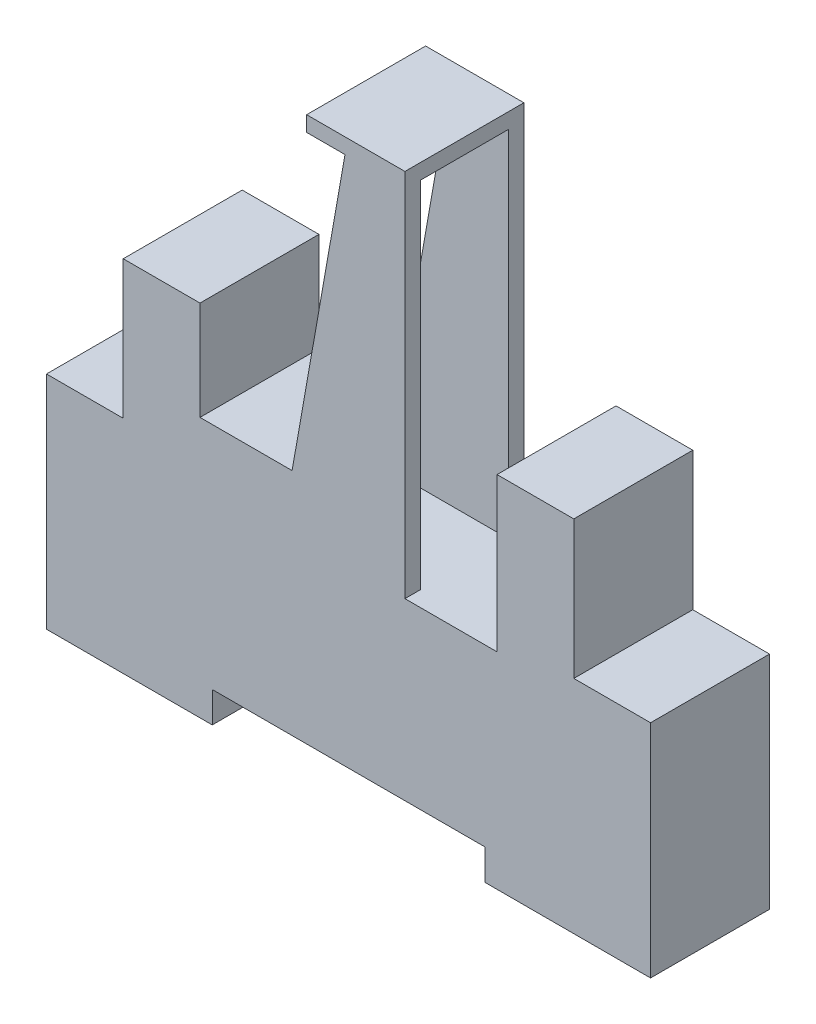
ISO-10303-21;
HEADER;
FILE_DESCRIPTION(('STEP AP214'),'2;1');
FILE_NAME('part.step','',(''),(''),'','','');
FILE_SCHEMA(('AUTOMOTIVE_DESIGN { 1 0 10303 214 1 1 1 1 }'));
ENDSEC;
DATA;
#1=APPLICATION_CONTEXT('core data for automotive mechanical design processes');
#2=APPLICATION_PROTOCOL_DEFINITION('international standard','automotive_design',2000,#1);
#3=PRODUCT_CONTEXT('',#1,'mechanical');
#4=PRODUCT('Part','Part','',(#3));
#5=PRODUCT_RELATED_PRODUCT_CATEGORY('part','',(#4));
#6=PRODUCT_DEFINITION_FORMATION('','',#4);
#7=PRODUCT_DEFINITION_CONTEXT('part definition',#1,'design');
#8=PRODUCT_DEFINITION('design','',#6,#7);
#9=PRODUCT_DEFINITION_SHAPE('','',#8);
#10=(LENGTH_UNIT() NAMED_UNIT(*) SI_UNIT(.MILLI.,.METRE.));
#11=(NAMED_UNIT(*) PLANE_ANGLE_UNIT() SI_UNIT($,.RADIAN.));
#12=(NAMED_UNIT(*) SI_UNIT($,.STERADIAN.) SOLID_ANGLE_UNIT());
#13=UNCERTAINTY_MEASURE_WITH_UNIT(LENGTH_MEASURE(1.E-05),#10,'distance_accuracy_value','');
#14=(GEOMETRIC_REPRESENTATION_CONTEXT(3) GLOBAL_UNCERTAINTY_ASSIGNED_CONTEXT((#13)) GLOBAL_UNIT_ASSIGNED_CONTEXT((#10,
#11,#12)) REPRESENTATION_CONTEXT('',''));
#15=CARTESIAN_POINT('',(0.,0.,0.));
#16=DIRECTION('',(0.,0.,1.));
#17=DIRECTION('',(1.,0.,0.));
#18=AXIS2_PLACEMENT_3D('',#15,#16,#17);
#19=CARTESIAN_POINT('',(-7.35,33.9,15.5));
#20=DIRECTION('',(0.984807753012209,-0.173648177666926,0.));
#21=DIRECTION('',(0.173648177666926,0.984807753012209,0.));
#22=AXIS2_PLACEMENT_3D('',#19,#20,#21);
#23=PLANE('',#22);
#24=DIRECTION('',(0.173648177666926,0.984807753012209,0.));
#25=VECTOR('',#24,1.);
#26=CARTESIAN_POINT('',(-7.35,33.9,13.5));
#27=LINE('',#26,#25);
#28=CARTESIAN_POINT('',(-7.35,33.9,13.5));
#29=VERTEX_POINT('',#28);
#30=CARTESIAN_POINT('',(-0.455615054299177,73.,13.5));
#31=VERTEX_POINT('',#30);
#32=EDGE_CURVE('E45',#29,#31,#27,.T.);
#33=ORIENTED_EDGE('',*,*,#32,.F.);
#34=DIRECTION('',(0.,0.,-1.));
#35=VECTOR('',#34,1.);
#36=CARTESIAN_POINT('',(-7.35,33.9,15.5));
#37=LINE('',#36,#35);
#38=CARTESIAN_POINT('',(-7.35,33.9,15.5));
#39=VERTEX_POINT('',#38);
#40=EDGE_CURVE('E368',#39,#29,#37,.T.);
#41=ORIENTED_EDGE('',*,*,#40,.F.);
#42=DIRECTION('',(-0.173648177666927,-0.984807753012209,0.));
#43=VECTOR('',#42,1.);
#44=CARTESIAN_POINT('',(-7.35,33.9,15.5));
#45=LINE('',#44,#43);
#46=CARTESIAN_POINT('',(-0.455615054299175,73.,15.5));
#47=VERTEX_POINT('',#46);
#48=EDGE_CURVE('E288',#47,#39,#45,.T.);
#49=ORIENTED_EDGE('',*,*,#48,.F.);
#50=DIRECTION('',(0.,0.,-1.));
#51=VECTOR('',#50,1.);
#52=CARTESIAN_POINT('',(-0.455615054299175,73.,15.5));
#53=LINE('',#52,#51);
#54=EDGE_CURVE('E372',#47,#31,#53,.T.);
#55=ORIENTED_EDGE('',*,*,#54,.T.);
#56=EDGE_LOOP('',(#33,#41,#49,#55));
#57=FACE_BOUND('',#56,.T.);
#58=ADVANCED_FACE('F37',(#57),#23,.F.);
#59=CARTESIAN_POINT('',(-17.75,0.,15.5));
#60=DIRECTION('',(0.,1.,0.));
#61=DIRECTION('',(-1.,0.,0.));
#62=AXIS2_PLACEMENT_3D('',#59,#60,#61);
#63=PLANE('',#62);
#64=DIRECTION('',(1.,0.,0.));
#65=VECTOR('',#64,1.);
#66=CARTESIAN_POINT('',(-17.75,0.,0.));
#67=LINE('',#66,#65);
#68=CARTESIAN_POINT('',(-39.35,0.,0.));
#69=VERTEX_POINT('',#68);
#70=CARTESIAN_POINT('',(-17.75,0.,0.));
#71=VERTEX_POINT('',#70);
#72=EDGE_CURVE('E255',#69,#71,#67,.T.);
#73=ORIENTED_EDGE('',*,*,#72,.T.);
#74=DIRECTION('',(0.,0.,-1.));
#75=VECTOR('',#74,1.);
#76=CARTESIAN_POINT('',(-17.75,0.,15.5));
#77=LINE('',#76,#75);
#78=CARTESIAN_POINT('',(-17.75,0.,15.5));
#79=VERTEX_POINT('',#78);
#80=EDGE_CURVE('E413',#79,#71,#77,.T.);
#81=ORIENTED_EDGE('',*,*,#80,.F.);
#82=DIRECTION('',(1.,0.,0.));
#83=VECTOR('',#82,1.);
#84=CARTESIAN_POINT('',(-17.75,0.,15.5));
#85=LINE('',#84,#83);
#86=CARTESIAN_POINT('',(-39.35,0.,15.5));
#87=VERTEX_POINT('',#86);
#88=EDGE_CURVE('E256',#87,#79,#85,.T.);
#89=ORIENTED_EDGE('',*,*,#88,.F.);
#90=DIRECTION('',(0.,0.,-1.));
#91=VECTOR('',#90,1.);
#92=CARTESIAN_POINT('',(-39.35,0.,15.5));
#93=LINE('',#92,#91);
#94=EDGE_CURVE('E302',#87,#69,#93,.T.);
#95=ORIENTED_EDGE('',*,*,#94,.T.);
#96=EDGE_LOOP('',(#73,#81,#89,#95));
#97=FACE_BOUND('',#96,.T.);
#98=ADVANCED_FACE('F39',(#97),#63,.F.);
#99=CARTESIAN_POINT('',(-17.75,3.99999999999999,15.5));
#100=DIRECTION('',(-1.,0.,0.));
#101=DIRECTION('',(0.,0.,1.));
#102=AXIS2_PLACEMENT_3D('',#99,#100,#101);
#103=PLANE('',#102);
#104=DIRECTION('',(0.,1.,0.));
#105=VECTOR('',#104,1.);
#106=CARTESIAN_POINT('',(-17.75,3.99999999999999,0.));
#107=LINE('',#106,#105);
#108=CARTESIAN_POINT('',(-17.75,3.99999999999999,0.));
#109=VERTEX_POINT('',#108);
#110=EDGE_CURVE('E305',#71,#109,#107,.T.);
#111=ORIENTED_EDGE('',*,*,#110,.T.);
#112=DIRECTION('',(0.,0.,-1.));
#113=VECTOR('',#112,1.);
#114=CARTESIAN_POINT('',(-17.75,3.99999999999999,15.5));
#115=LINE('',#114,#113);
#116=CARTESIAN_POINT('',(-17.75,3.99999999999999,15.5));
#117=VERTEX_POINT('',#116);
#118=EDGE_CURVE('E410',#117,#109,#115,.T.);
#119=ORIENTED_EDGE('',*,*,#118,.F.);
#120=DIRECTION('',(0.,1.,0.));
#121=VECTOR('',#120,1.);
#122=CARTESIAN_POINT('',(-17.75,3.99999999999999,15.5));
#123=LINE('',#122,#121);
#124=EDGE_CURVE('E259',#79,#117,#123,.T.);
#125=ORIENTED_EDGE('',*,*,#124,.F.);
#126=ORIENTED_EDGE('',*,*,#80,.T.);
#127=EDGE_LOOP('',(#111,#119,#125,#126));
#128=FACE_BOUND('',#127,.T.);
#129=ADVANCED_FACE('F476',(#128),#103,.F.);
#130=CARTESIAN_POINT('',(17.75,4.,15.5));
#131=DIRECTION('',(0.,1.,0.));
#132=DIRECTION('',(-1.,0.,0.));
#133=AXIS2_PLACEMENT_3D('',#130,#131,#132);
#134=PLANE('',#133);
#135=CARTESIAN_POINT('',(-1.65,4.,7.75));
#136=DIRECTION('',(0.,1.,0.));
#137=DIRECTION('',(-1.,0.,0.));
#138=AXIS2_PLACEMENT_3D('',#135,#136,#137);
#139=CIRCLE('',#138,1.6);
#140=CARTESIAN_POINT('',(-3.25,4.,7.75));
#141=VERTEX_POINT('',#140);
#142=EDGE_CURVE('E224',#141,#141,#139,.F.);
#143=ORIENTED_EDGE('',*,*,#142,.F.);
#144=EDGE_LOOP('',(#143));
#145=FACE_BOUND('',#144,.T.);
#146=DIRECTION('',(1.,0.,0.));
#147=VECTOR('',#146,1.);
#148=CARTESIAN_POINT('',(17.75,4.,0.));
#149=LINE('',#148,#147);
#150=CARTESIAN_POINT('',(17.75,4.,0.));
#151=VERTEX_POINT('',#150);
#152=EDGE_CURVE('E307',#109,#151,#149,.T.);
#153=ORIENTED_EDGE('',*,*,#152,.T.);
#154=DIRECTION('',(0.,0.,-1.));
#155=VECTOR('',#154,1.);
#156=CARTESIAN_POINT('',(17.75,4.,15.5));
#157=LINE('',#156,#155);
#158=CARTESIAN_POINT('',(17.75,4.,15.5));
#159=VERTEX_POINT('',#158);
#160=EDGE_CURVE('E407',#159,#151,#157,.T.);
#161=ORIENTED_EDGE('',*,*,#160,.F.);
#162=DIRECTION('',(1.,0.,0.));
#163=VECTOR('',#162,1.);
#164=CARTESIAN_POINT('',(17.75,4.,15.5));
#165=LINE('',#164,#163);
#166=EDGE_CURVE('E262',#117,#159,#165,.T.);
#167=ORIENTED_EDGE('',*,*,#166,.F.);
#168=ORIENTED_EDGE('',*,*,#118,.T.);
#169=EDGE_LOOP('',(#153,#161,#167,#168));
#170=FACE_BOUND('',#169,.T.);
#171=ADVANCED_FACE('F647',(#145,#170),#134,.F.);
#172=CARTESIAN_POINT('',(17.75,0.,15.5));
#173=DIRECTION('',(1.,0.,0.));
#174=DIRECTION('',(0.,0.,-1.));
#175=AXIS2_PLACEMENT_3D('',#172,#173,#174);
#176=PLANE('',#175);
#177=DIRECTION('',(0.,-1.,0.));
#178=VECTOR('',#177,1.);
#179=CARTESIAN_POINT('',(17.75,0.,0.));
#180=LINE('',#179,#178);
#181=CARTESIAN_POINT('',(17.75,0.,0.));
#182=VERTEX_POINT('',#181);
#183=EDGE_CURVE('E309',#151,#182,#180,.T.);
#184=ORIENTED_EDGE('',*,*,#183,.T.);
#185=DIRECTION('',(0.,0.,-1.));
#186=VECTOR('',#185,1.);
#187=CARTESIAN_POINT('',(17.75,0.,15.5));
#188=LINE('',#187,#186);
#189=CARTESIAN_POINT('',(17.75,0.,15.5));
#190=VERTEX_POINT('',#189);
#191=EDGE_CURVE('E404',#190,#182,#188,.T.);
#192=ORIENTED_EDGE('',*,*,#191,.F.);
#193=DIRECTION('',(0.,-1.,0.));
#194=VECTOR('',#193,1.);
#195=CARTESIAN_POINT('',(17.75,0.,15.5));
#196=LINE('',#195,#194);
#197=EDGE_CURVE('E264',#159,#190,#196,.T.);
#198=ORIENTED_EDGE('',*,*,#197,.F.);
#199=ORIENTED_EDGE('',*,*,#160,.T.);
#200=EDGE_LOOP('',(#184,#192,#198,#199));
#201=FACE_BOUND('',#200,.T.);
#202=ADVANCED_FACE('F637',(#201),#176,.F.);
#203=CARTESIAN_POINT('',(39.35,0.,15.5));
#204=DIRECTION('',(0.,1.,0.));
#205=DIRECTION('',(-1.,0.,0.));
#206=AXIS2_PLACEMENT_3D('',#203,#204,#205);
#207=PLANE('',#206);
#208=DIRECTION('',(1.,0.,0.));
#209=VECTOR('',#208,1.);
#210=CARTESIAN_POINT('',(39.35,0.,0.));
#211=LINE('',#210,#209);
#212=CARTESIAN_POINT('',(39.35,0.,0.));
#213=VERTEX_POINT('',#212);
#214=EDGE_CURVE('E311',#182,#213,#211,.T.);
#215=ORIENTED_EDGE('',*,*,#214,.T.);
#216=DIRECTION('',(0.,0.,-1.));
#217=VECTOR('',#216,1.);
#218=CARTESIAN_POINT('',(39.35,0.,15.5));
#219=LINE('',#218,#217);
#220=CARTESIAN_POINT('',(39.35,0.,15.5));
#221=VERTEX_POINT('',#220);
#222=EDGE_CURVE('E401',#221,#213,#219,.T.);
#223=ORIENTED_EDGE('',*,*,#222,.F.);
#224=DIRECTION('',(1.,0.,0.));
#225=VECTOR('',#224,1.);
#226=CARTESIAN_POINT('',(39.35,0.,15.5));
#227=LINE('',#226,#225);
#228=EDGE_CURVE('E266',#190,#221,#227,.T.);
#229=ORIENTED_EDGE('',*,*,#228,.F.);
#230=ORIENTED_EDGE('',*,*,#191,.T.);
#231=EDGE_LOOP('',(#215,#223,#229,#230));
#232=FACE_BOUND('',#231,.T.);
#233=ADVANCED_FACE('F627',(#232),#207,.F.);
#234=CARTESIAN_POINT('',(39.35,28.8,15.5));
#235=DIRECTION('',(-1.,0.,0.));
#236=DIRECTION('',(0.,0.,1.));
#237=AXIS2_PLACEMENT_3D('',#234,#235,#236);
#238=PLANE('',#237);
#239=DIRECTION('',(0.,1.,0.));
#240=VECTOR('',#239,1.);
#241=CARTESIAN_POINT('',(39.35,28.8,0.));
#242=LINE('',#241,#240);
#243=CARTESIAN_POINT('',(39.35,28.8,0.));
#244=VERTEX_POINT('',#243);
#245=EDGE_CURVE('E313',#213,#244,#242,.T.);
#246=ORIENTED_EDGE('',*,*,#245,.T.);
#247=DIRECTION('',(0.,0.,-1.));
#248=VECTOR('',#247,1.);
#249=CARTESIAN_POINT('',(39.35,28.8,15.5));
#250=LINE('',#249,#248);
#251=CARTESIAN_POINT('',(39.35,28.8,15.5));
#252=VERTEX_POINT('',#251);
#253=EDGE_CURVE('E398',#252,#244,#250,.T.);
#254=ORIENTED_EDGE('',*,*,#253,.F.);
#255=DIRECTION('',(0.,1.,0.));
#256=VECTOR('',#255,1.);
#257=CARTESIAN_POINT('',(39.35,28.8,15.5));
#258=LINE('',#257,#256);
#259=EDGE_CURVE('E268',#221,#252,#258,.T.);
#260=ORIENTED_EDGE('',*,*,#259,.F.);
#261=ORIENTED_EDGE('',*,*,#222,.T.);
#262=EDGE_LOOP('',(#246,#254,#260,#261));
#263=FACE_BOUND('',#262,.T.);
#264=ADVANCED_FACE('F617',(#263),#238,.F.);
#265=CARTESIAN_POINT('',(29.35,28.8,15.5));
#266=DIRECTION('',(0.,-1.,0.));
#267=DIRECTION('',(0.,0.,-1.));
#268=AXIS2_PLACEMENT_3D('',#265,#266,#267);
#269=PLANE('',#268);
#270=DIRECTION('',(-1.,0.,0.));
#271=VECTOR('',#270,1.);
#272=CARTESIAN_POINT('',(29.35,28.8,0.));
#273=LINE('',#272,#271);
#274=CARTESIAN_POINT('',(29.35,28.8,0.));
#275=VERTEX_POINT('',#274);
#276=EDGE_CURVE('E315',#244,#275,#273,.T.);
#277=ORIENTED_EDGE('',*,*,#276,.T.);
#278=DIRECTION('',(0.,0.,-1.));
#279=VECTOR('',#278,1.);
#280=CARTESIAN_POINT('',(29.35,28.8,15.5));
#281=LINE('',#280,#279);
#282=CARTESIAN_POINT('',(29.35,28.8,15.5));
#283=VERTEX_POINT('',#282);
#284=EDGE_CURVE('E395',#283,#275,#281,.T.);
#285=ORIENTED_EDGE('',*,*,#284,.F.);
#286=DIRECTION('',(-1.,0.,0.));
#287=VECTOR('',#286,1.);
#288=CARTESIAN_POINT('',(29.35,28.8,15.5));
#289=LINE('',#288,#287);
#290=EDGE_CURVE('E270',#252,#283,#289,.T.);
#291=ORIENTED_EDGE('',*,*,#290,.F.);
#292=ORIENTED_EDGE('',*,*,#253,.T.);
#293=EDGE_LOOP('',(#277,#285,#291,#292));
#294=FACE_BOUND('',#293,.T.);
#295=ADVANCED_FACE('F607',(#294),#269,.F.);
#296=CARTESIAN_POINT('',(29.35,46.8,15.5));
#297=DIRECTION('',(-1.,0.,0.));
#298=DIRECTION('',(0.,-1.,0.));
#299=AXIS2_PLACEMENT_3D('',#296,#297,#298);
#300=PLANE('',#299);
#301=DIRECTION('',(0.,1.,0.));
#302=VECTOR('',#301,1.);
#303=CARTESIAN_POINT('',(29.35,46.8,0.));
#304=LINE('',#303,#302);
#305=CARTESIAN_POINT('',(29.35,46.8,0.));
#306=VERTEX_POINT('',#305);
#307=EDGE_CURVE('E317',#275,#306,#304,.T.);
#308=ORIENTED_EDGE('',*,*,#307,.T.);
#309=DIRECTION('',(0.,0.,-1.));
#310=VECTOR('',#309,1.);
#311=CARTESIAN_POINT('',(29.35,46.8,15.5));
#312=LINE('',#311,#310);
#313=CARTESIAN_POINT('',(29.35,46.8,15.5));
#314=VERTEX_POINT('',#313);
#315=EDGE_CURVE('E392',#314,#306,#312,.T.);
#316=ORIENTED_EDGE('',*,*,#315,.F.);
#317=DIRECTION('',(0.,1.,0.));
#318=VECTOR('',#317,1.);
#319=CARTESIAN_POINT('',(29.35,46.8,15.5));
#320=LINE('',#319,#318);
#321=EDGE_CURVE('E272',#283,#314,#320,.T.);
#322=ORIENTED_EDGE('',*,*,#321,.F.);
#323=ORIENTED_EDGE('',*,*,#284,.T.);
#324=EDGE_LOOP('',(#308,#316,#322,#323));
#325=FACE_BOUND('',#324,.T.);
#326=ADVANCED_FACE('F597',(#325),#300,.F.);
#327=CARTESIAN_POINT('',(19.35,46.8,15.5));
#328=DIRECTION('',(0.,-1.,0.));
#329=DIRECTION('',(0.,0.,-1.));
#330=AXIS2_PLACEMENT_3D('',#327,#328,#329);
#331=PLANE('',#330);
#332=DIRECTION('',(-1.,0.,0.));
#333=VECTOR('',#332,1.);
#334=CARTESIAN_POINT('',(19.35,46.8,0.));
#335=LINE('',#334,#333);
#336=CARTESIAN_POINT('',(19.35,46.8,0.));
#337=VERTEX_POINT('',#336);
#338=EDGE_CURVE('E319',#306,#337,#335,.T.);
#339=ORIENTED_EDGE('',*,*,#338,.T.);
#340=DIRECTION('',(0.,0.,-1.));
#341=VECTOR('',#340,1.);
#342=CARTESIAN_POINT('',(19.35,46.8,15.5));
#343=LINE('',#342,#341);
#344=CARTESIAN_POINT('',(19.35,46.8,15.5));
#345=VERTEX_POINT('',#344);
#346=EDGE_CURVE('E389',#345,#337,#343,.T.);
#347=ORIENTED_EDGE('',*,*,#346,.F.);
#348=DIRECTION('',(-1.,0.,0.));
#349=VECTOR('',#348,1.);
#350=CARTESIAN_POINT('',(19.35,46.8,15.5));
#351=LINE('',#350,#349);
#352=EDGE_CURVE('E274',#314,#345,#351,.T.);
#353=ORIENTED_EDGE('',*,*,#352,.F.);
#354=ORIENTED_EDGE('',*,*,#315,.T.);
#355=EDGE_LOOP('',(#339,#347,#353,#354));
#356=FACE_BOUND('',#355,.T.);
#357=ADVANCED_FACE('F588',(#356),#331,.F.);
#358=CARTESIAN_POINT('',(19.35,26.8,15.5));
#359=DIRECTION('',(1.,0.,0.));
#360=DIRECTION('',(0.,0.,-1.));
#361=AXIS2_PLACEMENT_3D('',#358,#359,#360);
#362=PLANE('',#361);
#363=DIRECTION('',(0.,-1.,0.));
#364=VECTOR('',#363,1.);
#365=CARTESIAN_POINT('',(19.35,26.8,0.));
#366=LINE('',#365,#364);
#367=CARTESIAN_POINT('',(19.35,26.8,0.));
#368=VERTEX_POINT('',#367);
#369=EDGE_CURVE('E321',#337,#368,#366,.T.);
#370=ORIENTED_EDGE('',*,*,#369,.T.);
#371=DIRECTION('',(0.,0.,-1.));
#372=VECTOR('',#371,1.);
#373=CARTESIAN_POINT('',(19.35,26.8,15.5));
#374=LINE('',#373,#372);
#375=CARTESIAN_POINT('',(19.35,26.8,15.5));
#376=VERTEX_POINT('',#375);
#377=EDGE_CURVE('E386',#376,#368,#374,.T.);
#378=ORIENTED_EDGE('',*,*,#377,.F.);
#379=DIRECTION('',(0.,-1.,0.));
#380=VECTOR('',#379,1.);
#381=CARTESIAN_POINT('',(19.35,26.8,15.5));
#382=LINE('',#381,#380);
#383=EDGE_CURVE('E276',#345,#376,#382,.T.);
#384=ORIENTED_EDGE('',*,*,#383,.F.);
#385=ORIENTED_EDGE('',*,*,#346,.T.);
#386=EDGE_LOOP('',(#370,#378,#384,#385));
#387=FACE_BOUND('',#386,.T.);
#388=ADVANCED_FACE('F455',(#387),#362,.F.);
#389=CARTESIAN_POINT('',(7.34999999999999,26.8,15.5));
#390=DIRECTION('',(0.,-1.,0.));
#391=DIRECTION('',(0.,0.,-1.));
#392=AXIS2_PLACEMENT_3D('',#389,#390,#391);
#393=PLANE('',#392);
#394=CARTESIAN_POINT('',(-1.65,26.8,7.75));
#395=DIRECTION('',(0.,-1.,0.));
#396=DIRECTION('',(0.,0.,-1.));
#397=AXIS2_PLACEMENT_3D('',#394,#395,#396);
#398=CIRCLE('',#397,1.6);
#399=CARTESIAN_POINT('',(-1.65,26.8,6.15));
#400=VERTEX_POINT('',#399);
#401=EDGE_CURVE('E731',#400,#400,#398,.F.);
#402=ORIENTED_EDGE('',*,*,#401,.F.);
#403=EDGE_LOOP('',(#402));
#404=FACE_BOUND('',#403,.T.);
#405=DIRECTION('',(0.,0.,-1.));
#406=VECTOR('',#405,1.);
#407=CARTESIAN_POINT('',(7.34999999999999,26.8,15.5));
#408=LINE('',#407,#406);
#409=CARTESIAN_POINT('',(7.34999999999999,26.8,2.));
#410=VERTEX_POINT('',#409);
#411=CARTESIAN_POINT('',(7.34999999999999,26.8,0.));
#412=VERTEX_POINT('',#411);
#413=EDGE_CURVE('E383',#410,#412,#408,.T.);
#414=ORIENTED_EDGE('',*,*,#413,.F.);
#415=DIRECTION('',(1.,0.,0.));
#416=VECTOR('',#415,1.);
#417=CARTESIAN_POINT('',(-7.35,26.8,2.));
#418=LINE('',#417,#416);
#419=CARTESIAN_POINT('',(-7.35,26.8,2.));
#420=VERTEX_POINT('',#419);
#421=EDGE_CURVE('E233',#420,#410,#418,.T.);
#422=ORIENTED_EDGE('',*,*,#421,.F.);
#423=DIRECTION('',(0.,0.,1.));
#424=VECTOR('',#423,1.);
#425=CARTESIAN_POINT('',(-7.35,26.8,-49.4412663481516));
#426=LINE('',#425,#424);
#427=CARTESIAN_POINT('',(-7.35,26.8,13.5));
#428=VERTEX_POINT('',#427);
#429=EDGE_CURVE('E217',#420,#428,#426,.T.);
#430=ORIENTED_EDGE('',*,*,#429,.T.);
#431=DIRECTION('',(1.,0.,0.));
#432=VECTOR('',#431,1.);
#433=CARTESIAN_POINT('',(-7.35,26.8,13.5));
#434=LINE('',#433,#432);
#435=CARTESIAN_POINT('',(7.34999999999999,26.8,13.5));
#436=VERTEX_POINT('',#435);
#437=EDGE_CURVE('E223',#428,#436,#434,.T.);
#438=ORIENTED_EDGE('',*,*,#437,.T.);
#439=CARTESIAN_POINT('',(7.34999999999999,26.8,15.5));
#440=VERTEX_POINT('',#439);
#441=EDGE_CURVE('E384',#440,#436,#408,.T.);
#442=ORIENTED_EDGE('',*,*,#441,.F.);
#443=DIRECTION('',(-1.,0.,0.));
#444=VECTOR('',#443,1.);
#445=CARTESIAN_POINT('',(7.34999999999999,26.8,15.5));
#446=LINE('',#445,#444);
#447=EDGE_CURVE('E278',#376,#440,#446,.T.);
#448=ORIENTED_EDGE('',*,*,#447,.F.);
#449=ORIENTED_EDGE('',*,*,#377,.T.);
#450=DIRECTION('',(-1.,0.,0.));
#451=VECTOR('',#450,1.);
#452=CARTESIAN_POINT('',(7.34999999999999,26.8,0.));
#453=LINE('',#452,#451);
#454=EDGE_CURVE('E323',#368,#412,#453,.T.);
#455=ORIENTED_EDGE('',*,*,#454,.T.);
#456=EDGE_LOOP('',(#414,#422,#430,#438,#442,#448,#449,#455));
#457=FACE_BOUND('',#456,.T.);
#458=ADVANCED_FACE('F230',(#404,#457),#393,.F.);
#459=CARTESIAN_POINT('',(7.34999999999999,75.,15.5));
#460=DIRECTION('',(-1.,0.,0.));
#461=DIRECTION('',(0.,-1.,0.));
#462=AXIS2_PLACEMENT_3D('',#459,#460,#461);
#463=PLANE('',#462);
#464=DIRECTION('',(0.,0.,-1.));
#465=VECTOR('',#464,1.);
#466=CARTESIAN_POINT('',(7.34999999999999,73.,15.5));
#467=LINE('',#466,#465);
#468=CARTESIAN_POINT('',(7.34999999999999,73.,13.5));
#469=VERTEX_POINT('',#468);
#470=CARTESIAN_POINT('',(7.34999999999999,73.,2.));
#471=VERTEX_POINT('',#470);
#472=EDGE_CURVE('E234',#469,#471,#467,.T.);
#473=ORIENTED_EDGE('',*,*,#472,.T.);
#474=DIRECTION('',(0.,-1.,0.));
#475=VECTOR('',#474,1.);
#476=CARTESIAN_POINT('',(7.34999999999999,75.,2.));
#477=LINE('',#476,#475);
#478=EDGE_CURVE('E252',#471,#410,#477,.T.);
#479=ORIENTED_EDGE('',*,*,#478,.T.);
#480=ORIENTED_EDGE('',*,*,#413,.T.);
#481=DIRECTION('',(0.,1.,0.));
#482=VECTOR('',#481,1.);
#483=CARTESIAN_POINT('',(7.34999999999999,75.,0.));
#484=LINE('',#483,#482);
#485=CARTESIAN_POINT('',(7.34999999999999,75.,0.));
#486=VERTEX_POINT('',#485);
#487=EDGE_CURVE('E326',#412,#486,#484,.T.);
#488=ORIENTED_EDGE('',*,*,#487,.T.);
#489=DIRECTION('',(0.,0.,-1.));
#490=VECTOR('',#489,1.);
#491=CARTESIAN_POINT('',(7.34999999999999,75.,15.5));
#492=LINE('',#491,#490);
#493=CARTESIAN_POINT('',(7.34999999999999,75.,15.5));
#494=VERTEX_POINT('',#493);
#495=EDGE_CURVE('E380',#494,#486,#492,.T.);
#496=ORIENTED_EDGE('',*,*,#495,.F.);
#497=DIRECTION('',(0.,1.,0.));
#498=VECTOR('',#497,1.);
#499=CARTESIAN_POINT('',(7.34999999999999,75.,15.5));
#500=LINE('',#499,#498);
#501=EDGE_CURVE('E280',#440,#494,#500,.T.);
#502=ORIENTED_EDGE('',*,*,#501,.F.);
#503=ORIENTED_EDGE('',*,*,#441,.T.);
#504=DIRECTION('',(0.,-1.,0.));
#505=VECTOR('',#504,1.);
#506=CARTESIAN_POINT('',(7.34999999999999,75.,13.5));
#507=LINE('',#506,#505);
#508=EDGE_CURVE('E239',#469,#436,#507,.T.);
#509=ORIENTED_EDGE('',*,*,#508,.F.);
#510=EDGE_LOOP('',(#473,#479,#480,#488,#496,#502,#503,#509));
#511=FACE_BOUND('',#510,.T.);
#512=ADVANCED_FACE('F445',(#511),#463,.F.);
#513=CARTESIAN_POINT('',(-5.45561505429918,75.,15.5));
#514=DIRECTION('',(0.,-1.,0.));
#515=DIRECTION('',(0.,0.,-1.));
#516=AXIS2_PLACEMENT_3D('',#513,#514,#515);
#517=PLANE('',#516);
#518=DIRECTION('',(-1.,0.,0.));
#519=VECTOR('',#518,1.);
#520=CARTESIAN_POINT('',(-5.45561505429918,75.,0.));
#521=LINE('',#520,#519);
#522=CARTESIAN_POINT('',(-5.45561505429918,75.,0.));
#523=VERTEX_POINT('',#522);
#524=EDGE_CURVE('E328',#486,#523,#521,.T.);
#525=ORIENTED_EDGE('',*,*,#524,.T.);
#526=DIRECTION('',(0.,0.,-1.));
#527=VECTOR('',#526,1.);
#528=CARTESIAN_POINT('',(-5.45561505429918,75.,15.5));
#529=LINE('',#528,#527);
#530=CARTESIAN_POINT('',(-5.45561505429918,75.,15.5));
#531=VERTEX_POINT('',#530);
#532=EDGE_CURVE('E377',#531,#523,#529,.T.);
#533=ORIENTED_EDGE('',*,*,#532,.F.);
#534=DIRECTION('',(-1.,0.,0.));
#535=VECTOR('',#534,1.);
#536=CARTESIAN_POINT('',(-5.45561505429918,75.,15.5));
#537=LINE('',#536,#535);
#538=EDGE_CURVE('E282',#494,#531,#537,.T.);
#539=ORIENTED_EDGE('',*,*,#538,.F.);
#540=ORIENTED_EDGE('',*,*,#495,.T.);
#541=EDGE_LOOP('',(#525,#533,#539,#540));
#542=FACE_BOUND('',#541,.T.);
#543=ADVANCED_FACE('F462',(#542),#517,.F.);
#544=CARTESIAN_POINT('',(-5.45561505429918,73.,15.5));
#545=DIRECTION('',(1.,0.,0.));
#546=DIRECTION('',(0.,0.,-1.));
#547=AXIS2_PLACEMENT_3D('',#544,#545,#546);
#548=PLANE('',#547);
#549=DIRECTION('',(0.,-1.,0.));
#550=VECTOR('',#549,1.);
#551=CARTESIAN_POINT('',(-5.45561505429918,73.,0.));
#552=LINE('',#551,#550);
#553=CARTESIAN_POINT('',(-5.45561505429918,73.,0.));
#554=VERTEX_POINT('',#553);
#555=EDGE_CURVE('E330',#523,#554,#552,.T.);
#556=ORIENTED_EDGE('',*,*,#555,.T.);
#557=DIRECTION('',(0.,0.,-1.));
#558=VECTOR('',#557,1.);
#559=CARTESIAN_POINT('',(-5.45561505429918,73.,15.5));
#560=LINE('',#559,#558);
#561=CARTESIAN_POINT('',(-5.45561505429918,73.,15.5));
#562=VERTEX_POINT('',#561);
#563=EDGE_CURVE('E375',#562,#554,#560,.T.);
#564=ORIENTED_EDGE('',*,*,#563,.F.);
#565=DIRECTION('',(0.,-1.,0.));
#566=VECTOR('',#565,1.);
#567=CARTESIAN_POINT('',(-5.45561505429918,73.,15.5));
#568=LINE('',#567,#566);
#569=EDGE_CURVE('E284',#531,#562,#568,.T.);
#570=ORIENTED_EDGE('',*,*,#569,.F.);
#571=ORIENTED_EDGE('',*,*,#532,.T.);
#572=EDGE_LOOP('',(#556,#564,#570,#571));
#573=FACE_BOUND('',#572,.T.);
#574=ADVANCED_FACE('F431',(#573),#548,.F.);
#575=CARTESIAN_POINT('',(-0.455615054299175,73.,15.5));
#576=DIRECTION('',(0.,1.,0.));
#577=DIRECTION('',(0.,0.,1.));
#578=AXIS2_PLACEMENT_3D('',#575,#576,#577);
#579=PLANE('',#578);
#580=CARTESIAN_POINT('',(-0.455615054299177,73.,2.));
#581=VERTEX_POINT('',#580);
#582=CARTESIAN_POINT('',(-0.455615054299175,73.,0.));
#583=VERTEX_POINT('',#582);
#584=EDGE_CURVE('E371',#581,#583,#53,.T.);
#585=ORIENTED_EDGE('',*,*,#584,.F.);
#586=DIRECTION('',(-1.,0.,0.));
#587=VECTOR('',#586,1.);
#588=CARTESIAN_POINT('',(-7.35,73.,2.));
#589=LINE('',#588,#587);
#590=EDGE_CURVE('E52',#471,#581,#589,.T.);
#591=ORIENTED_EDGE('',*,*,#590,.F.);
#592=ORIENTED_EDGE('',*,*,#472,.F.);
#593=DIRECTION('',(-1.,0.,0.));
#594=VECTOR('',#593,1.);
#595=CARTESIAN_POINT('',(-7.35,73.,13.5));
#596=LINE('',#595,#594);
#597=EDGE_CURVE('E240',#469,#31,#596,.T.);
#598=ORIENTED_EDGE('',*,*,#597,.T.);
#599=ORIENTED_EDGE('',*,*,#54,.F.);
#600=DIRECTION('',(1.,0.,0.));
#601=VECTOR('',#600,1.);
#602=CARTESIAN_POINT('',(-0.455615054299175,73.,15.5));
#603=LINE('',#602,#601);
#604=EDGE_CURVE('E286',#562,#47,#603,.T.);
#605=ORIENTED_EDGE('',*,*,#604,.F.);
#606=ORIENTED_EDGE('',*,*,#563,.T.);
#607=DIRECTION('',(1.,0.,0.));
#608=VECTOR('',#607,1.);
#609=CARTESIAN_POINT('',(-0.455615054299175,73.,0.));
#610=LINE('',#609,#608);
#611=EDGE_CURVE('E333',#554,#583,#610,.T.);
#612=ORIENTED_EDGE('',*,*,#611,.T.);
#613=EDGE_LOOP('',(#585,#591,#592,#598,#599,#605,#606,#612));
#614=FACE_BOUND('',#613,.T.);
#615=ADVANCED_FACE('F418',(#614),#579,.F.);
#616=CARTESIAN_POINT('',(-7.35,33.9,2.));
#617=VERTEX_POINT('',#616);
#618=CARTESIAN_POINT('',(-7.35,33.9,0.));
#619=VERTEX_POINT('',#618);
#620=EDGE_CURVE('E367',#617,#619,#37,.T.);
#621=ORIENTED_EDGE('',*,*,#620,.F.);
#622=DIRECTION('',(0.173648177666926,0.984807753012209,0.));
#623=VECTOR('',#622,1.);
#624=CARTESIAN_POINT('',(-7.35,33.9,2.));
#625=LINE('',#624,#623);
#626=EDGE_CURVE('E12',#617,#581,#625,.T.);
#627=ORIENTED_EDGE('',*,*,#626,.T.);
#628=ORIENTED_EDGE('',*,*,#584,.T.);
#629=DIRECTION('',(-0.173648177666927,-0.984807753012209,0.));
#630=VECTOR('',#629,1.);
#631=CARTESIAN_POINT('',(-7.35,33.9,0.));
#632=LINE('',#631,#630);
#633=EDGE_CURVE('E336',#583,#619,#632,.T.);
#634=ORIENTED_EDGE('',*,*,#633,.T.);
#635=EDGE_LOOP('',(#621,#627,#628,#634));
#636=FACE_BOUND('',#635,.T.);
#637=ADVANCED_FACE('F441',(#636),#23,.F.);
#638=CARTESIAN_POINT('',(-19.35,33.9,15.5));
#639=DIRECTION('',(0.,-1.,0.));
#640=DIRECTION('',(0.,0.,-1.));
#641=AXIS2_PLACEMENT_3D('',#638,#639,#640);
#642=PLANE('',#641);
#643=DIRECTION('',(-1.,0.,0.));
#644=VECTOR('',#643,1.);
#645=CARTESIAN_POINT('',(-19.35,33.9,0.));
#646=LINE('',#645,#644);
#647=CARTESIAN_POINT('',(-19.35,33.9,0.));
#648=VERTEX_POINT('',#647);
#649=EDGE_CURVE('E339',#619,#648,#646,.T.);
#650=ORIENTED_EDGE('',*,*,#649,.T.);
#651=DIRECTION('',(0.,0.,-1.));
#652=VECTOR('',#651,1.);
#653=CARTESIAN_POINT('',(-19.35,33.9,15.5));
#654=LINE('',#653,#652);
#655=CARTESIAN_POINT('',(-19.35,33.9,15.5));
#656=VERTEX_POINT('',#655);
#657=EDGE_CURVE('E364',#656,#648,#654,.T.);
#658=ORIENTED_EDGE('',*,*,#657,.F.);
#659=DIRECTION('',(-1.,0.,0.));
#660=VECTOR('',#659,1.);
#661=CARTESIAN_POINT('',(-19.35,33.9,15.5));
#662=LINE('',#661,#660);
#663=EDGE_CURVE('E290',#39,#656,#662,.T.);
#664=ORIENTED_EDGE('',*,*,#663,.F.);
#665=ORIENTED_EDGE('',*,*,#40,.T.);
#666=EDGE_CURVE('E219',#29,#617,#37,.T.);
#667=ORIENTED_EDGE('',*,*,#666,.T.);
#668=ORIENTED_EDGE('',*,*,#620,.T.);
#669=EDGE_LOOP('',(#650,#658,#664,#665,#667,#668));
#670=FACE_BOUND('',#669,.T.);
#671=ADVANCED_FACE('F481',(#670),#642,.F.);
#672=CARTESIAN_POINT('',(-19.35,46.8,15.5));
#673=DIRECTION('',(-1.,0.,0.));
#674=DIRECTION('',(0.,0.,1.));
#675=AXIS2_PLACEMENT_3D('',#672,#673,#674);
#676=PLANE('',#675);
#677=DIRECTION('',(0.,1.,0.));
#678=VECTOR('',#677,1.);
#679=CARTESIAN_POINT('',(-19.35,46.8,0.));
#680=LINE('',#679,#678);
#681=CARTESIAN_POINT('',(-19.35,46.8,0.));
#682=VERTEX_POINT('',#681);
#683=EDGE_CURVE('E341',#648,#682,#680,.T.);
#684=ORIENTED_EDGE('',*,*,#683,.T.);
#685=DIRECTION('',(0.,0.,-1.));
#686=VECTOR('',#685,1.);
#687=CARTESIAN_POINT('',(-19.35,46.8,15.5));
#688=LINE('',#687,#686);
#689=CARTESIAN_POINT('',(-19.35,46.8,15.5));
#690=VERTEX_POINT('',#689);
#691=EDGE_CURVE('E361',#690,#682,#688,.T.);
#692=ORIENTED_EDGE('',*,*,#691,.F.);
#693=DIRECTION('',(0.,1.,0.));
#694=VECTOR('',#693,1.);
#695=CARTESIAN_POINT('',(-19.35,46.8,15.5));
#696=LINE('',#695,#694);
#697=EDGE_CURVE('E292',#656,#690,#696,.T.);
#698=ORIENTED_EDGE('',*,*,#697,.F.);
#699=ORIENTED_EDGE('',*,*,#657,.T.);
#700=EDGE_LOOP('',(#684,#692,#698,#699));
#701=FACE_BOUND('',#700,.T.);
#702=ADVANCED_FACE('F486',(#701),#676,.F.);
#703=CARTESIAN_POINT('',(-29.35,46.8,15.5));
#704=DIRECTION('',(0.,-1.,0.));
#705=DIRECTION('',(0.,0.,-1.));
#706=AXIS2_PLACEMENT_3D('',#703,#704,#705);
#707=PLANE('',#706);
#708=DIRECTION('',(-1.,0.,0.));
#709=VECTOR('',#708,1.);
#710=CARTESIAN_POINT('',(-29.35,46.8,0.));
#711=LINE('',#710,#709);
#712=CARTESIAN_POINT('',(-29.35,46.8,0.));
#713=VERTEX_POINT('',#712);
#714=EDGE_CURVE('E343',#682,#713,#711,.T.);
#715=ORIENTED_EDGE('',*,*,#714,.T.);
#716=DIRECTION('',(0.,0.,-1.));
#717=VECTOR('',#716,1.);
#718=CARTESIAN_POINT('',(-29.35,46.8,15.5));
#719=LINE('',#718,#717);
#720=CARTESIAN_POINT('',(-29.35,46.8,15.5));
#721=VERTEX_POINT('',#720);
#722=EDGE_CURVE('E358',#721,#713,#719,.T.);
#723=ORIENTED_EDGE('',*,*,#722,.F.);
#724=DIRECTION('',(-1.,0.,0.));
#725=VECTOR('',#724,1.);
#726=CARTESIAN_POINT('',(-29.35,46.8,15.5));
#727=LINE('',#726,#725);
#728=EDGE_CURVE('E294',#690,#721,#727,.T.);
#729=ORIENTED_EDGE('',*,*,#728,.F.);
#730=ORIENTED_EDGE('',*,*,#691,.T.);
#731=EDGE_LOOP('',(#715,#723,#729,#730));
#732=FACE_BOUND('',#731,.T.);
#733=ADVANCED_FACE('F556',(#732),#707,.F.);
#734=CARTESIAN_POINT('',(-29.35,28.8,15.5));
#735=DIRECTION('',(1.,0.,0.));
#736=DIRECTION('',(0.,0.,-1.));
#737=AXIS2_PLACEMENT_3D('',#734,#735,#736);
#738=PLANE('',#737);
#739=DIRECTION('',(0.,-1.,0.));
#740=VECTOR('',#739,1.);
#741=CARTESIAN_POINT('',(-29.35,28.8,0.));
#742=LINE('',#741,#740);
#743=CARTESIAN_POINT('',(-29.35,28.8,0.));
#744=VERTEX_POINT('',#743);
#745=EDGE_CURVE('E345',#713,#744,#742,.T.);
#746=ORIENTED_EDGE('',*,*,#745,.T.);
#747=DIRECTION('',(0.,0.,-1.));
#748=VECTOR('',#747,1.);
#749=CARTESIAN_POINT('',(-29.35,28.8,15.5));
#750=LINE('',#749,#748);
#751=CARTESIAN_POINT('',(-29.35,28.8,15.5));
#752=VERTEX_POINT('',#751);
#753=EDGE_CURVE('E355',#752,#744,#750,.T.);
#754=ORIENTED_EDGE('',*,*,#753,.F.);
#755=DIRECTION('',(0.,-1.,0.));
#756=VECTOR('',#755,1.);
#757=CARTESIAN_POINT('',(-29.35,28.8,15.5));
#758=LINE('',#757,#756);
#759=EDGE_CURVE('E296',#721,#752,#758,.T.);
#760=ORIENTED_EDGE('',*,*,#759,.F.);
#761=ORIENTED_EDGE('',*,*,#722,.T.);
#762=EDGE_LOOP('',(#746,#754,#760,#761));
#763=FACE_BOUND('',#762,.T.);
#764=ADVANCED_FACE('F546',(#763),#738,.F.);
#765=CARTESIAN_POINT('',(-39.35,28.8,15.5));
#766=DIRECTION('',(0.,-1.,0.));
#767=DIRECTION('',(0.,0.,-1.));
#768=AXIS2_PLACEMENT_3D('',#765,#766,#767);
#769=PLANE('',#768);
#770=DIRECTION('',(-1.,0.,0.));
#771=VECTOR('',#770,1.);
#772=CARTESIAN_POINT('',(-39.35,28.8,0.));
#773=LINE('',#772,#771);
#774=CARTESIAN_POINT('',(-39.35,28.8,0.));
#775=VERTEX_POINT('',#774);
#776=EDGE_CURVE('E347',#744,#775,#773,.T.);
#777=ORIENTED_EDGE('',*,*,#776,.T.);
#778=DIRECTION('',(0.,0.,-1.));
#779=VECTOR('',#778,1.);
#780=CARTESIAN_POINT('',(-39.35,28.8,15.5));
#781=LINE('',#780,#779);
#782=CARTESIAN_POINT('',(-39.35,28.8,15.5));
#783=VERTEX_POINT('',#782);
#784=EDGE_CURVE('E352',#783,#775,#781,.T.);
#785=ORIENTED_EDGE('',*,*,#784,.F.);
#786=DIRECTION('',(-1.,0.,0.));
#787=VECTOR('',#786,1.);
#788=CARTESIAN_POINT('',(-39.35,28.8,15.5));
#789=LINE('',#788,#787);
#790=EDGE_CURVE('E298',#752,#783,#789,.T.);
#791=ORIENTED_EDGE('',*,*,#790,.F.);
#792=ORIENTED_EDGE('',*,*,#753,.T.);
#793=EDGE_LOOP('',(#777,#785,#791,#792));
#794=FACE_BOUND('',#793,.T.);
#795=ADVANCED_FACE('F536',(#794),#769,.F.);
#796=CARTESIAN_POINT('',(-39.35,0.,15.5));
#797=DIRECTION('',(1.,0.,0.));
#798=DIRECTION('',(0.,0.,-1.));
#799=AXIS2_PLACEMENT_3D('',#796,#797,#798);
#800=PLANE('',#799);
#801=DIRECTION('',(0.,-1.,0.));
#802=VECTOR('',#801,1.);
#803=CARTESIAN_POINT('',(-39.35,0.,0.));
#804=LINE('',#803,#802);
#805=EDGE_CURVE('E260',#775,#69,#804,.T.);
#806=ORIENTED_EDGE('',*,*,#805,.T.);
#807=ORIENTED_EDGE('',*,*,#94,.F.);
#808=DIRECTION('',(0.,-1.,0.));
#809=VECTOR('',#808,1.);
#810=CARTESIAN_POINT('',(-39.35,0.,15.5));
#811=LINE('',#810,#809);
#812=EDGE_CURVE('E300',#783,#87,#811,.T.);
#813=ORIENTED_EDGE('',*,*,#812,.F.);
#814=ORIENTED_EDGE('',*,*,#784,.T.);
#815=EDGE_LOOP('',(#806,#807,#813,#814));
#816=FACE_BOUND('',#815,.T.);
#817=ADVANCED_FACE('F527',(#816),#800,.F.);
#818=CARTESIAN_POINT('',(0.,0.,15.5));
#819=DIRECTION('',(0.,0.,-1.));
#820=DIRECTION('',(-1.,0.,0.));
#821=AXIS2_PLACEMENT_3D('',#818,#819,#820);
#822=PLANE('',#821);
#823=ORIENTED_EDGE('',*,*,#88,.T.);
#824=ORIENTED_EDGE('',*,*,#124,.T.);
#825=ORIENTED_EDGE('',*,*,#166,.T.);
#826=ORIENTED_EDGE('',*,*,#197,.T.);
#827=ORIENTED_EDGE('',*,*,#228,.T.);
#828=ORIENTED_EDGE('',*,*,#259,.T.);
#829=ORIENTED_EDGE('',*,*,#290,.T.);
#830=ORIENTED_EDGE('',*,*,#321,.T.);
#831=ORIENTED_EDGE('',*,*,#352,.T.);
#832=ORIENTED_EDGE('',*,*,#383,.T.);
#833=ORIENTED_EDGE('',*,*,#447,.T.);
#834=ORIENTED_EDGE('',*,*,#501,.T.);
#835=ORIENTED_EDGE('',*,*,#538,.T.);
#836=ORIENTED_EDGE('',*,*,#569,.T.);
#837=ORIENTED_EDGE('',*,*,#604,.T.);
#838=ORIENTED_EDGE('',*,*,#48,.T.);
#839=ORIENTED_EDGE('',*,*,#663,.T.);
#840=ORIENTED_EDGE('',*,*,#697,.T.);
#841=ORIENTED_EDGE('',*,*,#728,.T.);
#842=ORIENTED_EDGE('',*,*,#759,.T.);
#843=ORIENTED_EDGE('',*,*,#790,.T.);
#844=ORIENTED_EDGE('',*,*,#812,.T.);
#845=EDGE_LOOP('',(#823,#824,#825,#826,#827,#828,#829,#830,#831,#832,#833,#834,#835,#836,#837,
#838,#839,#840,#841,#842,#843,#844));
#846=FACE_BOUND('',#845,.T.);
#847=ADVANCED_FACE('F423',(#846),#822,.F.);
#848=CARTESIAN_POINT('',(0.,0.,0.));
#849=DIRECTION('',(0.,0.,-1.));
#850=DIRECTION('',(-1.,0.,0.));
#851=AXIS2_PLACEMENT_3D('',#848,#849,#850);
#852=PLANE('',#851);
#853=ORIENTED_EDGE('',*,*,#72,.F.);
#854=ORIENTED_EDGE('',*,*,#805,.F.);
#855=ORIENTED_EDGE('',*,*,#776,.F.);
#856=ORIENTED_EDGE('',*,*,#745,.F.);
#857=ORIENTED_EDGE('',*,*,#714,.F.);
#858=ORIENTED_EDGE('',*,*,#683,.F.);
#859=ORIENTED_EDGE('',*,*,#649,.F.);
#860=ORIENTED_EDGE('',*,*,#633,.F.);
#861=ORIENTED_EDGE('',*,*,#611,.F.);
#862=ORIENTED_EDGE('',*,*,#555,.F.);
#863=ORIENTED_EDGE('',*,*,#524,.F.);
#864=ORIENTED_EDGE('',*,*,#487,.F.);
#865=ORIENTED_EDGE('',*,*,#454,.F.);
#866=ORIENTED_EDGE('',*,*,#369,.F.);
#867=ORIENTED_EDGE('',*,*,#338,.F.);
#868=ORIENTED_EDGE('',*,*,#307,.F.);
#869=ORIENTED_EDGE('',*,*,#276,.F.);
#870=ORIENTED_EDGE('',*,*,#245,.F.);
#871=ORIENTED_EDGE('',*,*,#214,.F.);
#872=ORIENTED_EDGE('',*,*,#183,.F.);
#873=ORIENTED_EDGE('',*,*,#152,.F.);
#874=ORIENTED_EDGE('',*,*,#110,.F.);
#875=EDGE_LOOP('',(#853,#854,#855,#856,#857,#858,#859,#860,#861,#862,#863,#864,#865,#866,#867,
#868,#869,#870,#871,#872,#873,#874));
#876=FACE_BOUND('',#875,.T.);
#877=ADVANCED_FACE('F436',(#876),#852,.T.);
#878=CARTESIAN_POINT('',(0.,0.,2.));
#879=DIRECTION('',(0.,0.,-1.));
#880=DIRECTION('',(-1.,0.,0.));
#881=AXIS2_PLACEMENT_3D('',#878,#879,#880);
#882=PLANE('',#881);
#883=ORIENTED_EDGE('',*,*,#590,.T.);
#884=ORIENTED_EDGE('',*,*,#626,.F.);
#885=DIRECTION('',(0.,-1.,0.));
#886=VECTOR('',#885,1.);
#887=CARTESIAN_POINT('',(-7.35,26.8,2.));
#888=LINE('',#887,#886);
#889=EDGE_CURVE('E60',#617,#420,#888,.T.);
#890=ORIENTED_EDGE('',*,*,#889,.T.);
#891=ORIENTED_EDGE('',*,*,#421,.T.);
#892=ORIENTED_EDGE('',*,*,#478,.F.);
#893=EDGE_LOOP('',(#883,#884,#890,#891,#892));
#894=FACE_BOUND('',#893,.T.);
#895=ADVANCED_FACE('F443',(#894),#882,.F.);
#896=CARTESIAN_POINT('',(0.,0.,13.5));
#897=DIRECTION('',(0.,0.,-1.));
#898=DIRECTION('',(-1.,0.,0.));
#899=AXIS2_PLACEMENT_3D('',#896,#897,#898);
#900=PLANE('',#899);
#901=ORIENTED_EDGE('',*,*,#508,.T.);
#902=ORIENTED_EDGE('',*,*,#437,.F.);
#903=DIRECTION('',(0.,-1.,0.));
#904=VECTOR('',#903,1.);
#905=CARTESIAN_POINT('',(-7.35,26.8,13.5));
#906=LINE('',#905,#904);
#907=EDGE_CURVE('E214',#29,#428,#906,.T.);
#908=ORIENTED_EDGE('',*,*,#907,.F.);
#909=ORIENTED_EDGE('',*,*,#32,.T.);
#910=ORIENTED_EDGE('',*,*,#597,.F.);
#911=EDGE_LOOP('',(#901,#902,#908,#909,#910));
#912=FACE_BOUND('',#911,.T.);
#913=ADVANCED_FACE('F236',(#912),#900,.T.);
#914=CARTESIAN_POINT('',(-7.35,26.8,-49.4412663481516));
#915=DIRECTION('',(-1.,0.,0.));
#916=DIRECTION('',(0.,0.,1.));
#917=AXIS2_PLACEMENT_3D('',#914,#915,#916);
#918=PLANE('',#917);
#919=ORIENTED_EDGE('',*,*,#907,.T.);
#920=ORIENTED_EDGE('',*,*,#429,.F.);
#921=ORIENTED_EDGE('',*,*,#889,.F.);
#922=ORIENTED_EDGE('',*,*,#666,.F.);
#923=EDGE_LOOP('',(#919,#920,#921,#922));
#924=FACE_BOUND('',#923,.T.);
#925=ADVANCED_FACE('F216',(#924),#918,.F.);
#926=CARTESIAN_POINT('',(-1.64999999999998,75.001,7.75));
#927=DIRECTION('',(0.,-1.,0.));
#928=DIRECTION('',(1.,0.,0.));
#929=AXIS2_PLACEMENT_3D('',#926,#927,#928);
#930=CYLINDRICAL_SURFACE('',#929,1.6);
#931=ORIENTED_EDGE('',*,*,#401,.T.);
#932=EDGE_LOOP('',(#931));
#933=FACE_BOUND('',#932,.T.);
#934=ORIENTED_EDGE('',*,*,#142,.T.);
#935=EDGE_LOOP('',(#934));
#936=FACE_BOUND('',#935,.T.);
#937=ADVANCED_FACE('F688',(#933,#936),#930,.F.);
#938=CLOSED_SHELL('',(#58,#98,#129,#171,#202,#233,#264,#295,#326,#357,#388,#458,#512,#543,#574,
#615,#637,#671,#702,#733,#764,#795,#817,#847,#877,#895,#913,#925,#937));
#939=MANIFOLD_SOLID_BREP('B2',#938);
#940=ADVANCED_BREP_SHAPE_REPRESENTATION('',(#18,#939),#14);
#941=SHAPE_DEFINITION_REPRESENTATION(#9,#940);
ENDSEC;
END-ISO-10303-21;
